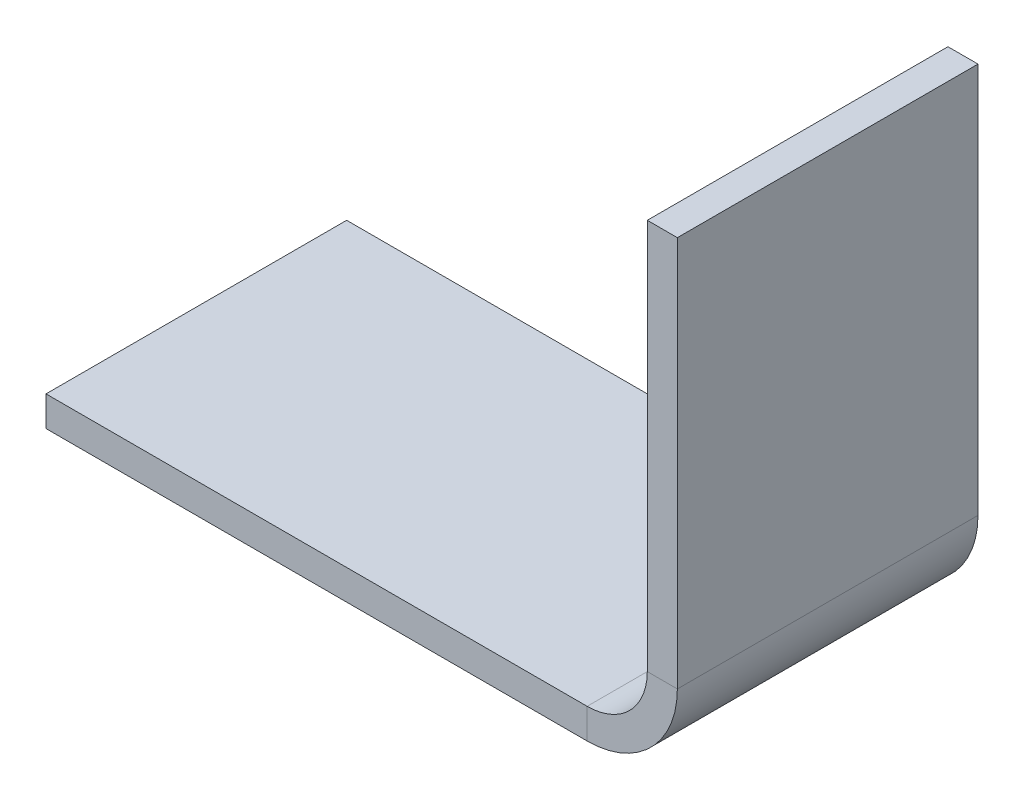
ISO-10303-21;
HEADER;
FILE_DESCRIPTION(('STEP AP214'),'2;1');
FILE_NAME('part.step','',(''),(''),'','','');
FILE_SCHEMA(('AUTOMOTIVE_DESIGN { 1 0 10303 214 1 1 1 1 }'));
ENDSEC;
DATA;
#1=APPLICATION_CONTEXT('core data for automotive mechanical design processes');
#2=APPLICATION_PROTOCOL_DEFINITION('international standard','automotive_design',2000,#1);
#3=PRODUCT_CONTEXT('',#1,'mechanical');
#4=PRODUCT('Part','Part','',(#3));
#5=PRODUCT_RELATED_PRODUCT_CATEGORY('part','',(#4));
#6=PRODUCT_DEFINITION_FORMATION('','',#4);
#7=PRODUCT_DEFINITION_CONTEXT('part definition',#1,'design');
#8=PRODUCT_DEFINITION('design','',#6,#7);
#9=PRODUCT_DEFINITION_SHAPE('','',#8);
#10=(LENGTH_UNIT() NAMED_UNIT(*) SI_UNIT(.MILLI.,.METRE.));
#11=(NAMED_UNIT(*) PLANE_ANGLE_UNIT() SI_UNIT($,.RADIAN.));
#12=(NAMED_UNIT(*) SI_UNIT($,.STERADIAN.) SOLID_ANGLE_UNIT());
#13=UNCERTAINTY_MEASURE_WITH_UNIT(LENGTH_MEASURE(1.E-05),#10,'distance_accuracy_value','');
#14=(GEOMETRIC_REPRESENTATION_CONTEXT(3) GLOBAL_UNCERTAINTY_ASSIGNED_CONTEXT((#13)) GLOBAL_UNIT_ASSIGNED_CONTEXT((#10,
#11,#12)) REPRESENTATION_CONTEXT('',''));
#15=CARTESIAN_POINT('',(0.,0.,0.));
#16=DIRECTION('',(0.,0.,1.));
#17=DIRECTION('',(1.,0.,0.));
#18=AXIS2_PLACEMENT_3D('',#15,#16,#17);
#19=CARTESIAN_POINT('',(20.,2.,10.));
#20=DIRECTION('',(0.,0.,1.));
#21=DIRECTION('',(1.,0.,0.));
#22=AXIS2_PLACEMENT_3D('',#19,#20,#21);
#23=PLANE('',#22);
#24=DIRECTION('',(1.,0.,0.));
#25=VECTOR('',#24,1.);
#26=CARTESIAN_POINT('',(20.,2.,10.));
#27=LINE('',#26,#25);
#28=CARTESIAN_POINT('',(20.,2.,10.));
#29=VERTEX_POINT('',#28);
#30=CARTESIAN_POINT('',(21.,2.,10.));
#31=VERTEX_POINT('',#30);
#32=EDGE_CURVE('E11',#29,#31,#27,.T.);
#33=ORIENTED_EDGE('',*,*,#32,.F.);
#34=CARTESIAN_POINT('',(18.,2.,10.));
#35=DIRECTION('',(0.,0.,-1.));
#36=DIRECTION('',(-1.,0.,0.));
#37=AXIS2_PLACEMENT_3D('',#34,#35,#36);
#38=CIRCLE('',#37,2.);
#39=CARTESIAN_POINT('',(18.,0.,10.));
#40=VERTEX_POINT('',#39);
#41=EDGE_CURVE('E136',#40,#29,#38,.F.);
#42=ORIENTED_EDGE('',*,*,#41,.F.);
#43=DIRECTION('',(0.,1.,0.));
#44=VECTOR('',#43,1.);
#45=CARTESIAN_POINT('',(18.,-1.,10.));
#46=LINE('',#45,#44);
#47=CARTESIAN_POINT('',(18.,-1.,10.));
#48=VERTEX_POINT('',#47);
#49=EDGE_CURVE('E47',#48,#40,#46,.T.);
#50=ORIENTED_EDGE('',*,*,#49,.F.);
#51=CARTESIAN_POINT('',(18.,2.,10.));
#52=DIRECTION('',(0.,0.,1.));
#53=DIRECTION('',(1.,0.,0.));
#54=AXIS2_PLACEMENT_3D('',#51,#52,#53);
#55=CIRCLE('',#54,3.);
#56=EDGE_CURVE('E133',#48,#31,#55,.T.);
#57=ORIENTED_EDGE('',*,*,#56,.T.);
#58=EDGE_LOOP('',(#33,#42,#50,#57));
#59=FACE_BOUND('',#58,.T.);
#60=ADVANCED_FACE('F41',(#59),#23,.T.);
#61=CARTESIAN_POINT('',(18.,-1.,10.));
#62=DIRECTION('',(0.,0.,1.));
#63=DIRECTION('',(1.,0.,0.));
#64=AXIS2_PLACEMENT_3D('',#61,#62,#63);
#65=PLANE('',#64);
#66=DIRECTION('',(0.,1.,0.));
#67=VECTOR('',#66,1.);
#68=CARTESIAN_POINT('',(20.,0.,10.));
#69=LINE('',#68,#67);
#70=CARTESIAN_POINT('',(20.,15.,10.));
#71=VERTEX_POINT('',#70);
#72=EDGE_CURVE('E189',#29,#71,#69,.T.);
#73=ORIENTED_EDGE('',*,*,#72,.F.);
#74=ORIENTED_EDGE('',*,*,#32,.T.);
#75=DIRECTION('',(0.,1.,0.));
#76=VECTOR('',#75,1.);
#77=CARTESIAN_POINT('',(21.,0.,10.));
#78=LINE('',#77,#76);
#79=CARTESIAN_POINT('',(21.,15.,10.));
#80=VERTEX_POINT('',#79);
#81=EDGE_CURVE('E100',#31,#80,#78,.T.);
#82=ORIENTED_EDGE('',*,*,#81,.T.);
#83=DIRECTION('',(1.,0.,0.));
#84=VECTOR('',#83,1.);
#85=CARTESIAN_POINT('',(20.,15.,10.));
#86=LINE('',#85,#84);
#87=EDGE_CURVE('E344',#71,#80,#86,.T.);
#88=ORIENTED_EDGE('',*,*,#87,.F.);
#89=EDGE_LOOP('',(#73,#74,#82,#88));
#90=FACE_BOUND('',#89,.T.);
#91=ADVANCED_FACE('F192',(#90),#65,.T.);
#92=CARTESIAN_POINT('',(18.,0.,0.));
#93=DIRECTION('',(0.,0.,-1.));
#94=DIRECTION('',(-1.,0.,0.));
#95=AXIS2_PLACEMENT_3D('',#92,#93,#94);
#96=PLANE('',#95);
#97=DIRECTION('',(0.,-1.,0.));
#98=VECTOR('',#97,1.);
#99=CARTESIAN_POINT('',(18.,0.,0.));
#100=LINE('',#99,#98);
#101=CARTESIAN_POINT('',(18.,0.,0.));
#102=VERTEX_POINT('',#101);
#103=CARTESIAN_POINT('',(18.,-1.,0.));
#104=VERTEX_POINT('',#103);
#105=EDGE_CURVE('E84',#102,#104,#100,.T.);
#106=ORIENTED_EDGE('',*,*,#105,.F.);
#107=CARTESIAN_POINT('',(18.,2.,0.));
#108=DIRECTION('',(0.,0.,-1.));
#109=DIRECTION('',(-1.,0.,0.));
#110=AXIS2_PLACEMENT_3D('',#107,#108,#109);
#111=CIRCLE('',#110,2.);
#112=CARTESIAN_POINT('',(20.,2.,0.));
#113=VERTEX_POINT('',#112);
#114=EDGE_CURVE('E153',#102,#113,#111,.F.);
#115=ORIENTED_EDGE('',*,*,#114,.T.);
#116=DIRECTION('',(-1.,0.,0.));
#117=VECTOR('',#116,1.);
#118=CARTESIAN_POINT('',(21.,2.,0.));
#119=LINE('',#118,#117);
#120=CARTESIAN_POINT('',(21.,2.,0.));
#121=VERTEX_POINT('',#120);
#122=EDGE_CURVE('E93',#121,#113,#119,.T.);
#123=ORIENTED_EDGE('',*,*,#122,.F.);
#124=CARTESIAN_POINT('',(18.,2.,0.));
#125=DIRECTION('',(0.,0.,1.));
#126=DIRECTION('',(1.,0.,0.));
#127=AXIS2_PLACEMENT_3D('',#124,#125,#126);
#128=CIRCLE('',#127,3.);
#129=EDGE_CURVE('E159',#104,#121,#128,.T.);
#130=ORIENTED_EDGE('',*,*,#129,.F.);
#131=EDGE_LOOP('',(#106,#115,#123,#130));
#132=FACE_BOUND('',#131,.T.);
#133=ADVANCED_FACE('F191',(#132),#96,.T.);
#134=CARTESIAN_POINT('',(21.,2.,0.));
#135=DIRECTION('',(0.,0.,-1.));
#136=DIRECTION('',(-1.,0.,0.));
#137=AXIS2_PLACEMENT_3D('',#134,#135,#136);
#138=PLANE('',#137);
#139=DIRECTION('',(1.,0.,0.));
#140=VECTOR('',#139,1.);
#141=CARTESIAN_POINT('',(0.,0.,0.));
#142=LINE('',#141,#140);
#143=CARTESIAN_POINT('',(0.,0.,0.));
#144=VERTEX_POINT('',#143);
#145=EDGE_CURVE('E154',#144,#102,#142,.T.);
#146=ORIENTED_EDGE('',*,*,#145,.T.);
#147=ORIENTED_EDGE('',*,*,#105,.T.);
#148=DIRECTION('',(1.,0.,0.));
#149=VECTOR('',#148,1.);
#150=CARTESIAN_POINT('',(0.,-1.,0.));
#151=LINE('',#150,#149);
#152=CARTESIAN_POINT('',(0.,-1.,0.));
#153=VERTEX_POINT('',#152);
#154=EDGE_CURVE('E158',#153,#104,#151,.T.);
#155=ORIENTED_EDGE('',*,*,#154,.F.);
#156=DIRECTION('',(0.,1.,0.));
#157=VECTOR('',#156,1.);
#158=CARTESIAN_POINT('',(0.,-1.,0.));
#159=LINE('',#158,#157);
#160=EDGE_CURVE('E120',#153,#144,#159,.T.);
#161=ORIENTED_EDGE('',*,*,#160,.T.);
#162=EDGE_LOOP('',(#146,#147,#155,#161));
#163=FACE_BOUND('',#162,.T.);
#164=ADVANCED_FACE('F190',(#163),#138,.T.);
#165=CARTESIAN_POINT('',(21.,0.,10.));
#166=DIRECTION('',(-1.,0.,0.));
#167=DIRECTION('',(0.,0.,1.));
#168=AXIS2_PLACEMENT_3D('',#165,#166,#167);
#169=PLANE('',#168);
#170=DIRECTION('',(0.,1.,0.));
#171=VECTOR('',#170,1.);
#172=CARTESIAN_POINT('',(21.,0.,0.));
#173=LINE('',#172,#171);
#174=CARTESIAN_POINT('',(21.,15.,0.));
#175=VERTEX_POINT('',#174);
#176=EDGE_CURVE('E145',#121,#175,#173,.T.);
#177=ORIENTED_EDGE('',*,*,#176,.T.);
#178=DIRECTION('',(0.,0.,-1.));
#179=VECTOR('',#178,1.);
#180=CARTESIAN_POINT('',(21.,15.,10.));
#181=LINE('',#180,#179);
#182=EDGE_CURVE('E175',#80,#175,#181,.T.);
#183=ORIENTED_EDGE('',*,*,#182,.F.);
#184=ORIENTED_EDGE('',*,*,#81,.F.);
#185=DIRECTION('',(0.,0.,-1.));
#186=VECTOR('',#185,1.);
#187=CARTESIAN_POINT('',(21.,2.,10.));
#188=LINE('',#187,#186);
#189=EDGE_CURVE('E141',#31,#121,#188,.T.);
#190=ORIENTED_EDGE('',*,*,#189,.T.);
#191=EDGE_LOOP('',(#177,#183,#184,#190));
#192=FACE_BOUND('',#191,.T.);
#193=ADVANCED_FACE('F203',(#192),#169,.F.);
#194=CARTESIAN_POINT('',(20.,15.,10.));
#195=DIRECTION('',(0.,1.,0.));
#196=DIRECTION('',(0.,0.,1.));
#197=AXIS2_PLACEMENT_3D('',#194,#195,#196);
#198=PLANE('',#197);
#199=DIRECTION('',(1.,0.,0.));
#200=VECTOR('',#199,1.);
#201=CARTESIAN_POINT('',(20.,15.,0.));
#202=LINE('',#201,#200);
#203=CARTESIAN_POINT('',(20.,15.,0.));
#204=VERTEX_POINT('',#203);
#205=EDGE_CURVE('E150',#204,#175,#202,.T.);
#206=ORIENTED_EDGE('',*,*,#205,.F.);
#207=DIRECTION('',(0.,0.,-1.));
#208=VECTOR('',#207,1.);
#209=CARTESIAN_POINT('',(20.,15.,10.));
#210=LINE('',#209,#208);
#211=EDGE_CURVE('E174',#71,#204,#210,.T.);
#212=ORIENTED_EDGE('',*,*,#211,.F.);
#213=ORIENTED_EDGE('',*,*,#87,.T.);
#214=ORIENTED_EDGE('',*,*,#182,.T.);
#215=EDGE_LOOP('',(#206,#212,#213,#214));
#216=FACE_BOUND('',#215,.T.);
#217=ADVANCED_FACE('F234',(#216),#198,.T.);
#218=CARTESIAN_POINT('',(20.,0.,10.));
#219=DIRECTION('',(-1.,0.,0.));
#220=DIRECTION('',(0.,0.,1.));
#221=AXIS2_PLACEMENT_3D('',#218,#219,#220);
#222=PLANE('',#221);
#223=DIRECTION('',(0.,1.,0.));
#224=VECTOR('',#223,1.);
#225=CARTESIAN_POINT('',(20.,0.,0.));
#226=LINE('',#225,#224);
#227=EDGE_CURVE('E147',#113,#204,#226,.T.);
#228=ORIENTED_EDGE('',*,*,#227,.F.);
#229=DIRECTION('',(0.,0.,-1.));
#230=VECTOR('',#229,1.);
#231=CARTESIAN_POINT('',(20.,2.,10.));
#232=LINE('',#231,#230);
#233=EDGE_CURVE('E166',#29,#113,#232,.T.);
#234=ORIENTED_EDGE('',*,*,#233,.F.);
#235=ORIENTED_EDGE('',*,*,#72,.T.);
#236=ORIENTED_EDGE('',*,*,#211,.T.);
#237=EDGE_LOOP('',(#228,#234,#235,#236));
#238=FACE_BOUND('',#237,.T.);
#239=ADVANCED_FACE('F241',(#238),#222,.T.);
#240=CARTESIAN_POINT('',(18.,2.,10.));
#241=DIRECTION('',(0.,0.,-1.));
#242=DIRECTION('',(-1.,0.,0.));
#243=AXIS2_PLACEMENT_3D('',#240,#241,#242);
#244=CYLINDRICAL_SURFACE('',#243,2.);
#245=ORIENTED_EDGE('',*,*,#114,.F.);
#246=DIRECTION('',(0.,0.,-1.));
#247=VECTOR('',#246,1.);
#248=CARTESIAN_POINT('',(18.,0.,10.));
#249=LINE('',#248,#247);
#250=EDGE_CURVE('E167',#40,#102,#249,.T.);
#251=ORIENTED_EDGE('',*,*,#250,.F.);
#252=ORIENTED_EDGE('',*,*,#41,.T.);
#253=ORIENTED_EDGE('',*,*,#233,.T.);
#254=EDGE_LOOP('',(#245,#251,#252,#253));
#255=FACE_BOUND('',#254,.T.);
#256=ADVANCED_FACE('F181',(#255),#244,.F.);
#257=CARTESIAN_POINT('',(0.,0.,10.));
#258=DIRECTION('',(0.,1.,0.));
#259=DIRECTION('',(0.,0.,1.));
#260=AXIS2_PLACEMENT_3D('',#257,#258,#259);
#261=PLANE('',#260);
#262=ORIENTED_EDGE('',*,*,#145,.F.);
#263=DIRECTION('',(0.,0.,-1.));
#264=VECTOR('',#263,1.);
#265=CARTESIAN_POINT('',(0.,0.,10.));
#266=LINE('',#265,#264);
#267=CARTESIAN_POINT('',(0.,0.,10.));
#268=VERTEX_POINT('',#267);
#269=EDGE_CURVE('E123',#268,#144,#266,.T.);
#270=ORIENTED_EDGE('',*,*,#269,.F.);
#271=DIRECTION('',(1.,0.,0.));
#272=VECTOR('',#271,1.);
#273=CARTESIAN_POINT('',(0.,0.,10.));
#274=LINE('',#273,#272);
#275=EDGE_CURVE('E138',#268,#40,#274,.T.);
#276=ORIENTED_EDGE('',*,*,#275,.T.);
#277=ORIENTED_EDGE('',*,*,#250,.T.);
#278=EDGE_LOOP('',(#262,#270,#276,#277));
#279=FACE_BOUND('',#278,.T.);
#280=ADVANCED_FACE('F187',(#279),#261,.T.);
#281=CARTESIAN_POINT('',(0.,-1.,10.));
#282=DIRECTION('',(-1.,0.,0.));
#283=DIRECTION('',(0.,0.,1.));
#284=AXIS2_PLACEMENT_3D('',#281,#282,#283);
#285=PLANE('',#284);
#286=ORIENTED_EDGE('',*,*,#160,.F.);
#287=DIRECTION('',(0.,0.,-1.));
#288=VECTOR('',#287,1.);
#289=CARTESIAN_POINT('',(0.,-1.,10.));
#290=LINE('',#289,#288);
#291=CARTESIAN_POINT('',(0.,-1.,10.));
#292=VERTEX_POINT('',#291);
#293=EDGE_CURVE('E114',#292,#153,#290,.T.);
#294=ORIENTED_EDGE('',*,*,#293,.F.);
#295=DIRECTION('',(0.,1.,0.));
#296=VECTOR('',#295,1.);
#297=CARTESIAN_POINT('',(0.,-1.,10.));
#298=LINE('',#297,#296);
#299=EDGE_CURVE('E119',#292,#268,#298,.T.);
#300=ORIENTED_EDGE('',*,*,#299,.T.);
#301=ORIENTED_EDGE('',*,*,#269,.T.);
#302=EDGE_LOOP('',(#286,#294,#300,#301));
#303=FACE_BOUND('',#302,.T.);
#304=ADVANCED_FACE('F113',(#303),#285,.T.);
#305=CARTESIAN_POINT('',(0.,-1.,10.));
#306=DIRECTION('',(0.,1.,0.));
#307=DIRECTION('',(0.,0.,1.));
#308=AXIS2_PLACEMENT_3D('',#305,#306,#307);
#309=PLANE('',#308);
#310=ORIENTED_EDGE('',*,*,#154,.T.);
#311=DIRECTION('',(0.,0.,-1.));
#312=VECTOR('',#311,1.);
#313=CARTESIAN_POINT('',(18.,-1.,10.));
#314=LINE('',#313,#312);
#315=EDGE_CURVE('E125',#48,#104,#314,.T.);
#316=ORIENTED_EDGE('',*,*,#315,.F.);
#317=DIRECTION('',(1.,0.,0.));
#318=VECTOR('',#317,1.);
#319=CARTESIAN_POINT('',(0.,-1.,10.));
#320=LINE('',#319,#318);
#321=EDGE_CURVE('E127',#292,#48,#320,.T.);
#322=ORIENTED_EDGE('',*,*,#321,.F.);
#323=ORIENTED_EDGE('',*,*,#293,.T.);
#324=EDGE_LOOP('',(#310,#316,#322,#323));
#325=FACE_BOUND('',#324,.T.);
#326=ADVANCED_FACE('F130',(#325),#309,.F.);
#327=CARTESIAN_POINT('',(18.,2.,10.));
#328=DIRECTION('',(0.,0.,-1.));
#329=DIRECTION('',(-1.,0.,0.));
#330=AXIS2_PLACEMENT_3D('',#327,#328,#329);
#331=CYLINDRICAL_SURFACE('',#330,3.);
#332=ORIENTED_EDGE('',*,*,#129,.T.);
#333=ORIENTED_EDGE('',*,*,#189,.F.);
#334=ORIENTED_EDGE('',*,*,#56,.F.);
#335=ORIENTED_EDGE('',*,*,#315,.T.);
#336=EDGE_LOOP('',(#332,#333,#334,#335));
#337=FACE_BOUND('',#336,.T.);
#338=ADVANCED_FACE('F193',(#337),#331,.T.);
#339=CARTESIAN_POINT('',(18.,2.,10.));
#340=DIRECTION('',(0.,0.,-1.));
#341=DIRECTION('',(-1.,0.,0.));
#342=AXIS2_PLACEMENT_3D('',#339,#340,#341);
#343=PLANE('',#342);
#344=ORIENTED_EDGE('',*,*,#321,.T.);
#345=ORIENTED_EDGE('',*,*,#49,.T.);
#346=ORIENTED_EDGE('',*,*,#275,.F.);
#347=ORIENTED_EDGE('',*,*,#299,.F.);
#348=EDGE_LOOP('',(#344,#345,#346,#347));
#349=FACE_BOUND('',#348,.T.);
#350=ADVANCED_FACE('F135',(#349),#343,.F.);
#351=CARTESIAN_POINT('',(18.,2.,0.));
#352=DIRECTION('',(0.,0.,-1.));
#353=DIRECTION('',(-1.,0.,0.));
#354=AXIS2_PLACEMENT_3D('',#351,#352,#353);
#355=PLANE('',#354);
#356=ORIENTED_EDGE('',*,*,#176,.F.);
#357=ORIENTED_EDGE('',*,*,#122,.T.);
#358=ORIENTED_EDGE('',*,*,#227,.T.);
#359=ORIENTED_EDGE('',*,*,#205,.T.);
#360=EDGE_LOOP('',(#356,#357,#358,#359));
#361=FACE_BOUND('',#360,.T.);
#362=ADVANCED_FACE('F313',(#361),#355,.T.);
#363=CLOSED_SHELL('',(#60,#91,#133,#164,#193,#217,#239,#256,#280,#304,#326,#338,#350,#362));
#364=MANIFOLD_SOLID_BREP('B2',#363);
#365=ADVANCED_BREP_SHAPE_REPRESENTATION('',(#18,#364),#14);
#366=SHAPE_DEFINITION_REPRESENTATION(#9,#365);
ENDSEC;
END-ISO-10303-21;
